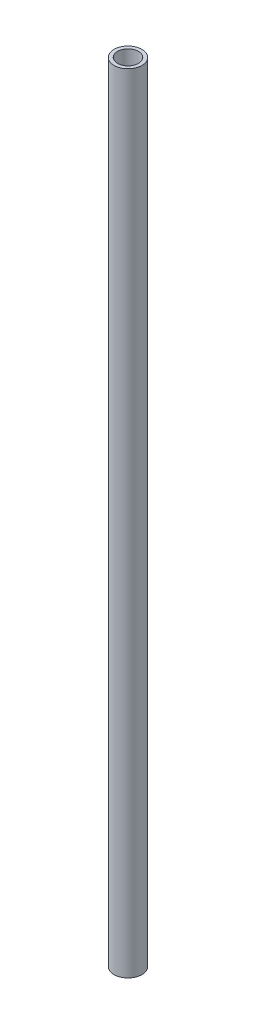
ISO-10303-21;
HEADER;
FILE_DESCRIPTION(('STEP AP214'),'2;1');
FILE_NAME('part.step','',(''),(''),'','','');
FILE_SCHEMA(('AUTOMOTIVE_DESIGN { 1 0 10303 214 1 1 1 1 }'));
ENDSEC;
DATA;
#1=APPLICATION_CONTEXT('core data for automotive mechanical design processes');
#2=APPLICATION_PROTOCOL_DEFINITION('international standard','automotive_design',2000,#1);
#3=PRODUCT_CONTEXT('',#1,'mechanical');
#4=PRODUCT('Part','Part','',(#3));
#5=PRODUCT_RELATED_PRODUCT_CATEGORY('part','',(#4));
#6=PRODUCT_DEFINITION_FORMATION('','',#4);
#7=PRODUCT_DEFINITION_CONTEXT('part definition',#1,'design');
#8=PRODUCT_DEFINITION('design','',#6,#7);
#9=PRODUCT_DEFINITION_SHAPE('','',#8);
#10=(LENGTH_UNIT() NAMED_UNIT(*) SI_UNIT(.MILLI.,.METRE.));
#11=(NAMED_UNIT(*) PLANE_ANGLE_UNIT() SI_UNIT($,.RADIAN.));
#12=(NAMED_UNIT(*) SI_UNIT($,.STERADIAN.) SOLID_ANGLE_UNIT());
#13=UNCERTAINTY_MEASURE_WITH_UNIT(LENGTH_MEASURE(1.E-05),#10,'distance_accuracy_value','');
#14=(GEOMETRIC_REPRESENTATION_CONTEXT(3) GLOBAL_UNCERTAINTY_ASSIGNED_CONTEXT((#13)) GLOBAL_UNIT_ASSIGNED_CONTEXT((#10,
#11,#12)) REPRESENTATION_CONTEXT('',''));
#15=CARTESIAN_POINT('',(0.,0.,0.));
#16=DIRECTION('',(0.,0.,1.));
#17=DIRECTION('',(1.,0.,0.));
#18=AXIS2_PLACEMENT_3D('',#15,#16,#17);
#19=CARTESIAN_POINT('',(0.,226.,0.));
#20=DIRECTION('',(0.,1.,0.));
#21=DIRECTION('',(0.,0.,1.));
#22=AXIS2_PLACEMENT_3D('',#19,#20,#21);
#23=PLANE('',#22);
#24=CARTESIAN_POINT('',(0.,226.,0.));
#25=DIRECTION('',(0.,1.,0.));
#26=DIRECTION('',(0.,0.,1.));
#27=AXIS2_PLACEMENT_3D('',#24,#25,#26);
#28=CIRCLE('',#27,4.);
#29=CARTESIAN_POINT('',(0.,226.,4.));
#30=VERTEX_POINT('',#29);
#31=EDGE_CURVE('E10',#30,#30,#28,.T.);
#32=ORIENTED_EDGE('',*,*,#31,.T.);
#33=EDGE_LOOP('',(#32));
#34=FACE_BOUND('',#33,.T.);
#35=CARTESIAN_POINT('',(0.,226.,0.));
#36=DIRECTION('',(0.,1.,0.));
#37=DIRECTION('',(0.,0.,1.));
#38=AXIS2_PLACEMENT_3D('',#35,#36,#37);
#39=CIRCLE('',#38,3.);
#40=CARTESIAN_POINT('',(0.,226.,3.));
#41=VERTEX_POINT('',#40);
#42=EDGE_CURVE('E45',#41,#41,#39,.T.);
#43=ORIENTED_EDGE('',*,*,#42,.F.);
#44=EDGE_LOOP('',(#43));
#45=FACE_BOUND('',#44,.T.);
#46=ADVANCED_FACE('F34',(#34,#45),#23,.T.);
#47=CARTESIAN_POINT('',(0.,0.,0.));
#48=DIRECTION('',(0.,1.,0.));
#49=DIRECTION('',(0.,0.,1.));
#50=AXIS2_PLACEMENT_3D('',#47,#48,#49);
#51=PLANE('',#50);
#52=CARTESIAN_POINT('',(0.,0.,0.));
#53=DIRECTION('',(0.,1.,0.));
#54=DIRECTION('',(0.,0.,1.));
#55=AXIS2_PLACEMENT_3D('',#52,#53,#54);
#56=CIRCLE('',#55,4.);
#57=CARTESIAN_POINT('',(0.,0.,4.));
#58=VERTEX_POINT('',#57);
#59=EDGE_CURVE('E38',#58,#58,#56,.T.);
#60=ORIENTED_EDGE('',*,*,#59,.F.);
#61=EDGE_LOOP('',(#60));
#62=FACE_BOUND('',#61,.T.);
#63=CARTESIAN_POINT('',(0.,0.,0.));
#64=DIRECTION('',(0.,1.,0.));
#65=DIRECTION('',(0.,0.,1.));
#66=AXIS2_PLACEMENT_3D('',#63,#64,#65);
#67=CIRCLE('',#66,3.);
#68=CARTESIAN_POINT('',(0.,0.,3.));
#69=VERTEX_POINT('',#68);
#70=EDGE_CURVE('E47',#69,#69,#67,.T.);
#71=ORIENTED_EDGE('',*,*,#70,.T.);
#72=EDGE_LOOP('',(#71));
#73=FACE_BOUND('',#72,.T.);
#74=ADVANCED_FACE('F57',(#62,#73),#51,.F.);
#75=CARTESIAN_POINT('',(0.,226.,0.));
#76=DIRECTION('',(0.,-1.,0.));
#77=DIRECTION('',(0.,0.,-1.));
#78=AXIS2_PLACEMENT_3D('',#75,#76,#77);
#79=CYLINDRICAL_SURFACE('',#78,4.);
#80=ORIENTED_EDGE('',*,*,#31,.F.);
#81=EDGE_LOOP('',(#80));
#82=FACE_BOUND('',#81,.T.);
#83=ORIENTED_EDGE('',*,*,#59,.T.);
#84=EDGE_LOOP('',(#83));
#85=FACE_BOUND('',#84,.T.);
#86=ADVANCED_FACE('F36',(#82,#85),#79,.T.);
#87=CARTESIAN_POINT('',(0.,226.,0.));
#88=DIRECTION('',(0.,-1.,0.));
#89=DIRECTION('',(0.,0.,-1.));
#90=AXIS2_PLACEMENT_3D('',#87,#88,#89);
#91=CYLINDRICAL_SURFACE('',#90,3.);
#92=ORIENTED_EDGE('',*,*,#42,.T.);
#93=EDGE_LOOP('',(#92));
#94=FACE_BOUND('',#93,.T.);
#95=ORIENTED_EDGE('',*,*,#70,.F.);
#96=EDGE_LOOP('',(#95));
#97=FACE_BOUND('',#96,.T.);
#98=ADVANCED_FACE('F53',(#94,#97),#91,.F.);
#99=CLOSED_SHELL('',(#46,#74,#86,#98));
#100=MANIFOLD_SOLID_BREP('B2',#99);
#101=ADVANCED_BREP_SHAPE_REPRESENTATION('',(#18,#100),#14);
#102=SHAPE_DEFINITION_REPRESENTATION(#9,#101);
ENDSEC;
END-ISO-10303-21;
